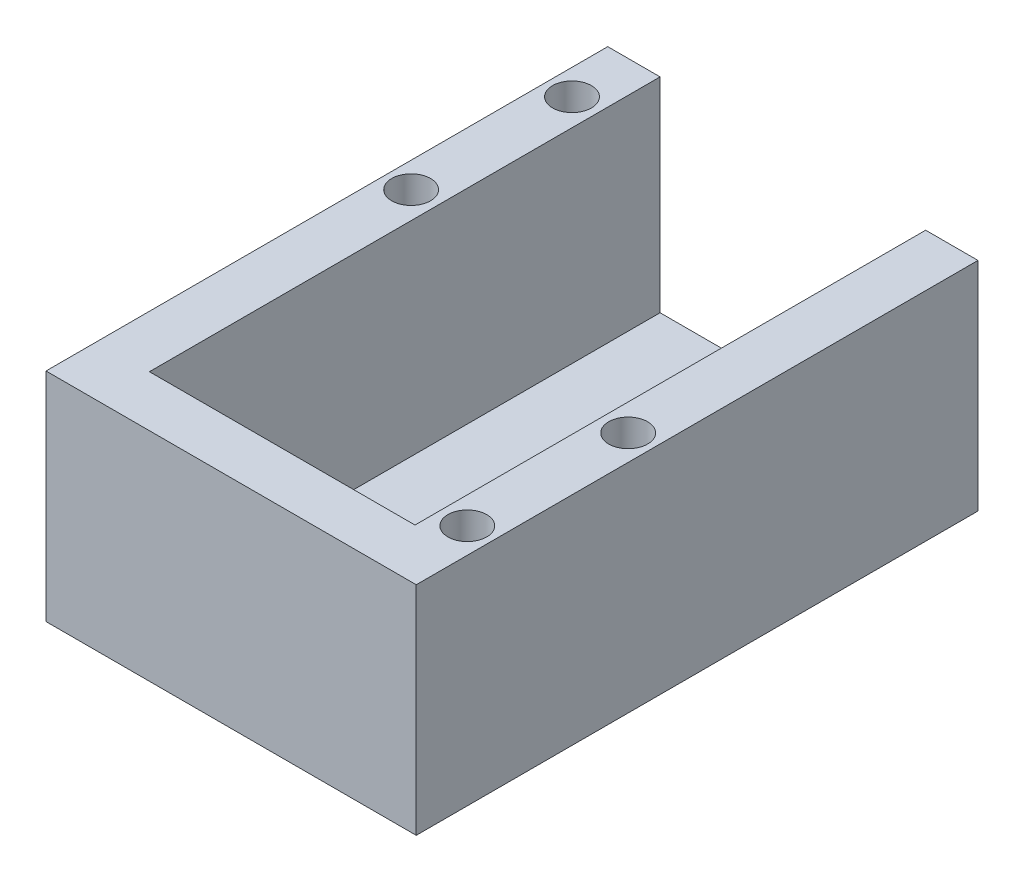
ISO-10303-21;
HEADER;
FILE_DESCRIPTION(('STEP AP214'),'2;1');
FILE_NAME('part.step','',(''),(''),'','','');
FILE_SCHEMA(('AUTOMOTIVE_DESIGN { 1 0 10303 214 1 1 1 1 }'));
ENDSEC;
DATA;
#1=APPLICATION_CONTEXT('core data for automotive mechanical design processes');
#2=APPLICATION_PROTOCOL_DEFINITION('international standard','automotive_design',2000,#1);
#3=PRODUCT_CONTEXT('',#1,'mechanical');
#4=PRODUCT('Part','Part','',(#3));
#5=PRODUCT_RELATED_PRODUCT_CATEGORY('part','',(#4));
#6=PRODUCT_DEFINITION_FORMATION('','',#4);
#7=PRODUCT_DEFINITION_CONTEXT('part definition',#1,'design');
#8=PRODUCT_DEFINITION('design','',#6,#7);
#9=PRODUCT_DEFINITION_SHAPE('','',#8);
#10=(LENGTH_UNIT() NAMED_UNIT(*) SI_UNIT(.MILLI.,.METRE.));
#11=(NAMED_UNIT(*) PLANE_ANGLE_UNIT() SI_UNIT($,.RADIAN.));
#12=(NAMED_UNIT(*) SI_UNIT($,.STERADIAN.) SOLID_ANGLE_UNIT());
#13=UNCERTAINTY_MEASURE_WITH_UNIT(LENGTH_MEASURE(1.E-05),#10,'distance_accuracy_value','');
#14=(GEOMETRIC_REPRESENTATION_CONTEXT(3) GLOBAL_UNCERTAINTY_ASSIGNED_CONTEXT((#13)) GLOBAL_UNIT_ASSIGNED_CONTEXT((#10,
#11,#12)) REPRESENTATION_CONTEXT('',''));
#15=CARTESIAN_POINT('',(0.,0.,0.));
#16=DIRECTION('',(0.,0.,1.));
#17=DIRECTION('',(1.,0.,0.));
#18=AXIS2_PLACEMENT_3D('',#15,#16,#17);
#19=CARTESIAN_POINT('',(-18.415,21.59,0.));
#20=DIRECTION('',(0.,0.,-1.));
#21=DIRECTION('',(-1.,0.,0.));
#22=AXIS2_PLACEMENT_3D('',#19,#20,#21);
#23=PLANE('',#22);
#24=DIRECTION('',(1.,0.,0.));
#25=VECTOR('',#24,1.);
#26=CARTESIAN_POINT('',(-18.415,0.,0.));
#27=LINE('',#26,#25);
#28=CARTESIAN_POINT('',(-18.415,0.,0.));
#29=VERTEX_POINT('',#28);
#30=CARTESIAN_POINT('',(18.415,0.,0.));
#31=VERTEX_POINT('',#30);
#32=EDGE_CURVE('E193',#29,#31,#27,.T.);
#33=ORIENTED_EDGE('',*,*,#32,.T.);
#34=DIRECTION('',(0.,-1.,0.));
#35=VECTOR('',#34,1.);
#36=CARTESIAN_POINT('',(18.415,21.59,0.));
#37=LINE('',#36,#35);
#38=CARTESIAN_POINT('',(18.415,21.59,0.));
#39=VERTEX_POINT('',#38);
#40=EDGE_CURVE('E11',#39,#31,#37,.T.);
#41=ORIENTED_EDGE('',*,*,#40,.F.);
#42=DIRECTION('',(1.,0.,0.));
#43=VECTOR('',#42,1.);
#44=CARTESIAN_POINT('',(-18.415,21.59,0.));
#45=LINE('',#44,#43);
#46=CARTESIAN_POINT('',(-18.415,21.59,0.));
#47=VERTEX_POINT('',#46);
#48=EDGE_CURVE('E203',#47,#39,#45,.T.);
#49=ORIENTED_EDGE('',*,*,#48,.F.);
#50=DIRECTION('',(0.,-1.,0.));
#51=VECTOR('',#50,1.);
#52=CARTESIAN_POINT('',(-18.415,21.59,0.));
#53=LINE('',#52,#51);
#54=EDGE_CURVE('E215',#47,#29,#53,.T.);
#55=ORIENTED_EDGE('',*,*,#54,.T.);
#56=EDGE_LOOP('',(#33,#41,#49,#55));
#57=FACE_BOUND('',#56,.T.);
#58=ADVANCED_FACE('F39',(#57),#23,.F.);
#59=CARTESIAN_POINT('',(18.415,21.59,0.));
#60=DIRECTION('',(-1.,0.,0.));
#61=DIRECTION('',(0.,0.,1.));
#62=AXIS2_PLACEMENT_3D('',#59,#60,#61);
#63=PLANE('',#62);
#64=DIRECTION('',(0.,0.,-1.));
#65=VECTOR('',#64,1.);
#66=CARTESIAN_POINT('',(18.415,0.,0.));
#67=LINE('',#66,#65);
#68=CARTESIAN_POINT('',(18.415,0.,-55.88));
#69=VERTEX_POINT('',#68);
#70=EDGE_CURVE('E219',#31,#69,#67,.T.);
#71=ORIENTED_EDGE('',*,*,#70,.T.);
#72=DIRECTION('',(0.,-1.,0.));
#73=VECTOR('',#72,1.);
#74=CARTESIAN_POINT('',(18.415,21.59,-55.88));
#75=LINE('',#74,#73);
#76=CARTESIAN_POINT('',(18.415,21.59,-55.88));
#77=VERTEX_POINT('',#76);
#78=EDGE_CURVE('E47',#77,#69,#75,.T.);
#79=ORIENTED_EDGE('',*,*,#78,.F.);
#80=DIRECTION('',(0.,0.,-1.));
#81=VECTOR('',#80,1.);
#82=CARTESIAN_POINT('',(18.415,21.59,0.));
#83=LINE('',#82,#81);
#84=EDGE_CURVE('E91',#39,#77,#83,.T.);
#85=ORIENTED_EDGE('',*,*,#84,.F.);
#86=ORIENTED_EDGE('',*,*,#40,.T.);
#87=EDGE_LOOP('',(#71,#79,#85,#86));
#88=FACE_BOUND('',#87,.T.);
#89=ADVANCED_FACE('F274',(#88),#63,.F.);
#90=CARTESIAN_POINT('',(-18.415,21.59,-55.88));
#91=DIRECTION('',(0.,0.,1.));
#92=DIRECTION('',(1.,0.,0.));
#93=AXIS2_PLACEMENT_3D('',#90,#91,#92);
#94=PLANE('',#93);
#95=DIRECTION('',(-1.,0.,0.));
#96=VECTOR('',#95,1.);
#97=CARTESIAN_POINT('',(-18.415,21.59,-55.88));
#98=LINE('',#97,#96);
#99=CARTESIAN_POINT('',(-13.208,21.59,-55.88));
#100=VERTEX_POINT('',#99);
#101=CARTESIAN_POINT('',(-18.415,21.59,-55.88));
#102=VERTEX_POINT('',#101);
#103=EDGE_CURVE('E208',#100,#102,#98,.T.);
#104=ORIENTED_EDGE('',*,*,#103,.F.);
#105=DIRECTION('',(0.,1.,0.));
#106=VECTOR('',#105,1.);
#107=CARTESIAN_POINT('',(-13.208,21.59,-55.88));
#108=LINE('',#107,#106);
#109=CARTESIAN_POINT('',(-13.208,1.27,-55.88));
#110=VERTEX_POINT('',#109);
#111=EDGE_CURVE('E166',#110,#100,#108,.T.);
#112=ORIENTED_EDGE('',*,*,#111,.F.);
#113=DIRECTION('',(-1.,0.,0.));
#114=VECTOR('',#113,1.);
#115=CARTESIAN_POINT('',(13.208,1.27,-55.88));
#116=LINE('',#115,#114);
#117=CARTESIAN_POINT('',(13.208,1.27,-55.88));
#118=VERTEX_POINT('',#117);
#119=EDGE_CURVE('E170',#118,#110,#116,.T.);
#120=ORIENTED_EDGE('',*,*,#119,.F.);
#121=DIRECTION('',(0.,-1.,0.));
#122=VECTOR('',#121,1.);
#123=CARTESIAN_POINT('',(13.208,21.59,-55.88));
#124=LINE('',#123,#122);
#125=CARTESIAN_POINT('',(13.208,21.59,-55.88));
#126=VERTEX_POINT('',#125);
#127=EDGE_CURVE('E183',#126,#118,#124,.T.);
#128=ORIENTED_EDGE('',*,*,#127,.F.);
#129=EDGE_CURVE('E209',#77,#126,#98,.T.);
#130=ORIENTED_EDGE('',*,*,#129,.F.);
#131=ORIENTED_EDGE('',*,*,#78,.T.);
#132=DIRECTION('',(-1.,0.,0.));
#133=VECTOR('',#132,1.);
#134=CARTESIAN_POINT('',(-18.415,0.,-55.88));
#135=LINE('',#134,#133);
#136=CARTESIAN_POINT('',(-18.415,0.,-55.88));
#137=VERTEX_POINT('',#136);
#138=EDGE_CURVE('E222',#69,#137,#135,.T.);
#139=ORIENTED_EDGE('',*,*,#138,.T.);
#140=DIRECTION('',(0.,-1.,0.));
#141=VECTOR('',#140,1.);
#142=CARTESIAN_POINT('',(-18.415,21.59,-55.88));
#143=LINE('',#142,#141);
#144=EDGE_CURVE('E229',#102,#137,#143,.T.);
#145=ORIENTED_EDGE('',*,*,#144,.F.);
#146=EDGE_LOOP('',(#104,#112,#120,#128,#130,#131,#139,#145));
#147=FACE_BOUND('',#146,.T.);
#148=ADVANCED_FACE('F237',(#147),#94,.F.);
#149=CARTESIAN_POINT('',(-18.415,21.59,0.));
#150=DIRECTION('',(1.,0.,0.));
#151=DIRECTION('',(0.,0.,-1.));
#152=AXIS2_PLACEMENT_3D('',#149,#150,#151);
#153=PLANE('',#152);
#154=DIRECTION('',(0.,0.,1.));
#155=VECTOR('',#154,1.);
#156=CARTESIAN_POINT('',(-18.415,0.,0.));
#157=LINE('',#156,#155);
#158=EDGE_CURVE('E84',#137,#29,#157,.T.);
#159=ORIENTED_EDGE('',*,*,#158,.T.);
#160=ORIENTED_EDGE('',*,*,#54,.F.);
#161=DIRECTION('',(0.,0.,1.));
#162=VECTOR('',#161,1.);
#163=CARTESIAN_POINT('',(-18.415,21.59,0.));
#164=LINE('',#163,#162);
#165=EDGE_CURVE('E63',#102,#47,#164,.T.);
#166=ORIENTED_EDGE('',*,*,#165,.F.);
#167=ORIENTED_EDGE('',*,*,#144,.T.);
#168=EDGE_LOOP('',(#159,#160,#166,#167));
#169=FACE_BOUND('',#168,.T.);
#170=ADVANCED_FACE('F246',(#169),#153,.F.);
#171=CARTESIAN_POINT('',(0.,21.59,0.));
#172=DIRECTION('',(0.,1.,0.));
#173=DIRECTION('',(0.,0.,1.));
#174=AXIS2_PLACEMENT_3D('',#171,#172,#173);
#175=PLANE('',#174);
#176=CARTESIAN_POINT('',(15.875,21.59,-7.62000000000001));
#177=DIRECTION('',(0.,1.,0.));
#178=DIRECTION('',(0.,0.,1.));
#179=AXIS2_PLACEMENT_3D('',#176,#177,#178);
#180=CIRCLE('',#179,1.9304);
#181=CARTESIAN_POINT('',(15.875,21.59,-5.68960000000001));
#182=VERTEX_POINT('',#181);
#183=EDGE_CURVE('E137',#182,#182,#180,.T.);
#184=ORIENTED_EDGE('',*,*,#183,.F.);
#185=EDGE_LOOP('',(#184));
#186=FACE_BOUND('',#185,.T.);
#187=CARTESIAN_POINT('',(15.875,21.59,-23.622));
#188=DIRECTION('',(0.,1.,0.));
#189=DIRECTION('',(0.,0.,1.));
#190=AXIS2_PLACEMENT_3D('',#187,#188,#189);
#191=CIRCLE('',#190,1.9304);
#192=CARTESIAN_POINT('',(15.875,21.59,-21.6916));
#193=VERTEX_POINT('',#192);
#194=EDGE_CURVE('E136',#193,#193,#191,.T.);
#195=ORIENTED_EDGE('',*,*,#194,.F.);
#196=EDGE_LOOP('',(#195));
#197=FACE_BOUND('',#196,.T.);
#198=CARTESIAN_POINT('',(-15.875,21.59,-33.782));
#199=DIRECTION('',(0.,1.,0.));
#200=DIRECTION('',(0.,0.,1.));
#201=AXIS2_PLACEMENT_3D('',#198,#199,#200);
#202=CIRCLE('',#201,1.9304);
#203=CARTESIAN_POINT('',(-15.875,21.59,-31.8516));
#204=VERTEX_POINT('',#203);
#205=EDGE_CURVE('E150',#204,#204,#202,.T.);
#206=ORIENTED_EDGE('',*,*,#205,.F.);
#207=EDGE_LOOP('',(#206));
#208=FACE_BOUND('',#207,.T.);
#209=CARTESIAN_POINT('',(-15.875,21.59,-49.784));
#210=DIRECTION('',(0.,1.,0.));
#211=DIRECTION('',(0.,0.,1.));
#212=AXIS2_PLACEMENT_3D('',#209,#210,#211);
#213=CIRCLE('',#212,1.9304);
#214=CARTESIAN_POINT('',(-15.875,21.59,-47.8536));
#215=VERTEX_POINT('',#214);
#216=EDGE_CURVE('E158',#215,#215,#213,.T.);
#217=ORIENTED_EDGE('',*,*,#216,.F.);
#218=EDGE_LOOP('',(#217));
#219=FACE_BOUND('',#218,.T.);
#220=DIRECTION('',(0.,0.,-1.));
#221=VECTOR('',#220,1.);
#222=CARTESIAN_POINT('',(-13.208,21.59,-5.08000000000002));
#223=LINE('',#222,#221);
#224=CARTESIAN_POINT('',(-13.208,21.59,-5.08000000000002));
#225=VERTEX_POINT('',#224);
#226=EDGE_CURVE('E180',#225,#100,#223,.T.);
#227=ORIENTED_EDGE('',*,*,#226,.T.);
#228=ORIENTED_EDGE('',*,*,#103,.T.);
#229=ORIENTED_EDGE('',*,*,#165,.T.);
#230=ORIENTED_EDGE('',*,*,#48,.T.);
#231=ORIENTED_EDGE('',*,*,#84,.T.);
#232=ORIENTED_EDGE('',*,*,#129,.T.);
#233=DIRECTION('',(0.,0.,-1.));
#234=VECTOR('',#233,1.);
#235=CARTESIAN_POINT('',(13.208,21.59,-5.08000000000002));
#236=LINE('',#235,#234);
#237=CARTESIAN_POINT('',(13.208,21.59,-5.08000000000002));
#238=VERTEX_POINT('',#237);
#239=EDGE_CURVE('E197',#238,#126,#236,.T.);
#240=ORIENTED_EDGE('',*,*,#239,.F.);
#241=DIRECTION('',(1.,0.,0.));
#242=VECTOR('',#241,1.);
#243=CARTESIAN_POINT('',(13.208,21.59,-5.08000000000002));
#244=LINE('',#243,#242);
#245=EDGE_CURVE('E169',#225,#238,#244,.T.);
#246=ORIENTED_EDGE('',*,*,#245,.F.);
#247=EDGE_LOOP('',(#227,#228,#229,#230,#231,#232,#240,#246));
#248=FACE_BOUND('',#247,.T.);
#249=ADVANCED_FACE('F250',(#186,#197,#208,#219,#248),#175,.T.);
#250=CARTESIAN_POINT('',(0.,0.,0.));
#251=DIRECTION('',(0.,1.,0.));
#252=DIRECTION('',(0.,0.,1.));
#253=AXIS2_PLACEMENT_3D('',#250,#251,#252);
#254=PLANE('',#253);
#255=ORIENTED_EDGE('',*,*,#32,.F.);
#256=ORIENTED_EDGE('',*,*,#158,.F.);
#257=ORIENTED_EDGE('',*,*,#138,.F.);
#258=ORIENTED_EDGE('',*,*,#70,.F.);
#259=EDGE_LOOP('',(#255,#256,#257,#258));
#260=FACE_BOUND('',#259,.T.);
#261=ADVANCED_FACE('F242',(#260),#254,.F.);
#262=CARTESIAN_POINT('',(-13.208,21.59,-5.08000000000002));
#263=DIRECTION('',(-1.,0.,0.));
#264=DIRECTION('',(0.,0.,1.));
#265=AXIS2_PLACEMENT_3D('',#262,#263,#264);
#266=PLANE('',#265);
#267=ORIENTED_EDGE('',*,*,#111,.T.);
#268=ORIENTED_EDGE('',*,*,#226,.F.);
#269=DIRECTION('',(0.,1.,0.));
#270=VECTOR('',#269,1.);
#271=CARTESIAN_POINT('',(-13.208,21.59,-5.08000000000002));
#272=LINE('',#271,#270);
#273=CARTESIAN_POINT('',(-13.208,1.27,-5.08000000000002));
#274=VERTEX_POINT('',#273);
#275=EDGE_CURVE('E54',#274,#225,#272,.T.);
#276=ORIENTED_EDGE('',*,*,#275,.F.);
#277=DIRECTION('',(0.,0.,-1.));
#278=VECTOR('',#277,1.);
#279=CARTESIAN_POINT('',(-13.208,1.27,-5.08000000000002));
#280=LINE('',#279,#278);
#281=EDGE_CURVE('E190',#274,#110,#280,.T.);
#282=ORIENTED_EDGE('',*,*,#281,.T.);
#283=EDGE_LOOP('',(#267,#268,#276,#282));
#284=FACE_BOUND('',#283,.T.);
#285=ADVANCED_FACE('F254',(#284),#266,.F.);
#286=CARTESIAN_POINT('',(13.208,1.27,-5.08000000000002));
#287=DIRECTION('',(0.,-1.,0.));
#288=DIRECTION('',(0.,0.,-1.));
#289=AXIS2_PLACEMENT_3D('',#286,#287,#288);
#290=PLANE('',#289);
#291=ORIENTED_EDGE('',*,*,#119,.T.);
#292=ORIENTED_EDGE('',*,*,#281,.F.);
#293=DIRECTION('',(-1.,0.,0.));
#294=VECTOR('',#293,1.);
#295=CARTESIAN_POINT('',(13.208,1.27,-5.08000000000002));
#296=LINE('',#295,#294);
#297=CARTESIAN_POINT('',(13.208,1.27,-5.08000000000002));
#298=VERTEX_POINT('',#297);
#299=EDGE_CURVE('E177',#298,#274,#296,.T.);
#300=ORIENTED_EDGE('',*,*,#299,.F.);
#301=DIRECTION('',(0.,0.,-1.));
#302=VECTOR('',#301,1.);
#303=CARTESIAN_POINT('',(13.208,1.27,-5.08000000000002));
#304=LINE('',#303,#302);
#305=EDGE_CURVE('E194',#298,#118,#304,.T.);
#306=ORIENTED_EDGE('',*,*,#305,.T.);
#307=EDGE_LOOP('',(#291,#292,#300,#306));
#308=FACE_BOUND('',#307,.T.);
#309=ADVANCED_FACE('F257',(#308),#290,.F.);
#310=CARTESIAN_POINT('',(13.208,21.59,-5.08000000000002));
#311=DIRECTION('',(1.,0.,0.));
#312=DIRECTION('',(0.,1.,0.));
#313=AXIS2_PLACEMENT_3D('',#310,#311,#312);
#314=PLANE('',#313);
#315=ORIENTED_EDGE('',*,*,#127,.T.);
#316=ORIENTED_EDGE('',*,*,#305,.F.);
#317=DIRECTION('',(0.,-1.,0.));
#318=VECTOR('',#317,1.);
#319=CARTESIAN_POINT('',(13.208,21.59,-5.08000000000002));
#320=LINE('',#319,#318);
#321=EDGE_CURVE('E173',#238,#298,#320,.T.);
#322=ORIENTED_EDGE('',*,*,#321,.F.);
#323=ORIENTED_EDGE('',*,*,#239,.T.);
#324=EDGE_LOOP('',(#315,#316,#322,#323));
#325=FACE_BOUND('',#324,.T.);
#326=ADVANCED_FACE('F259',(#325),#314,.F.);
#327=CARTESIAN_POINT('',(0.,0.,-5.08000000000002));
#328=DIRECTION('',(0.,0.,-1.));
#329=DIRECTION('',(-1.,0.,0.));
#330=AXIS2_PLACEMENT_3D('',#327,#328,#329);
#331=PLANE('',#330);
#332=ORIENTED_EDGE('',*,*,#275,.T.);
#333=ORIENTED_EDGE('',*,*,#245,.T.);
#334=ORIENTED_EDGE('',*,*,#321,.T.);
#335=ORIENTED_EDGE('',*,*,#299,.T.);
#336=EDGE_LOOP('',(#332,#333,#334,#335));
#337=FACE_BOUND('',#336,.T.);
#338=ADVANCED_FACE('F260',(#337),#331,.T.);
#339=CARTESIAN_POINT('',(-15.875,16.51,-49.784));
#340=DIRECTION('',(0.,1.,0.));
#341=DIRECTION('',(0.,0.,1.));
#342=AXIS2_PLACEMENT_3D('',#339,#340,#341);
#343=CONICAL_SURFACE('',#342,1.9304,1.02974425867665);
#344=CARTESIAN_POINT('',(-15.875,15.3500986610292,-49.784));
#345=VERTEX_POINT('',#344);
#346=VERTEX_LOOP('',#345);
#347=FACE_BOUND('',#346,.T.);
#348=CARTESIAN_POINT('',(-15.875,16.51,-49.784));
#349=DIRECTION('',(0.,1.,0.));
#350=DIRECTION('',(0.,0.,1.));
#351=AXIS2_PLACEMENT_3D('',#348,#349,#350);
#352=CIRCLE('',#351,1.9304);
#353=CARTESIAN_POINT('',(-15.875,16.51,-47.8536));
#354=VERTEX_POINT('',#353);
#355=EDGE_CURVE('E162',#354,#354,#352,.T.);
#356=ORIENTED_EDGE('',*,*,#355,.T.);
#357=EDGE_LOOP('',(#356));
#358=FACE_BOUND('',#357,.T.);
#359=ADVANCED_FACE('F262',(#347,#358),#343,.F.);
#360=CARTESIAN_POINT('',(-15.875,21.59,-49.784));
#361=DIRECTION('',(0.,1.,0.));
#362=DIRECTION('',(0.,0.,1.));
#363=AXIS2_PLACEMENT_3D('',#360,#361,#362);
#364=CYLINDRICAL_SURFACE('',#363,1.9304);
#365=ORIENTED_EDGE('',*,*,#355,.F.);
#366=EDGE_LOOP('',(#365));
#367=FACE_BOUND('',#366,.T.);
#368=ORIENTED_EDGE('',*,*,#216,.T.);
#369=EDGE_LOOP('',(#368));
#370=FACE_BOUND('',#369,.T.);
#371=ADVANCED_FACE('F268',(#367,#370),#364,.F.);
#372=CARTESIAN_POINT('',(-15.875,16.51,-33.782));
#373=DIRECTION('',(0.,1.,0.));
#374=DIRECTION('',(0.,0.,1.));
#375=AXIS2_PLACEMENT_3D('',#372,#373,#374);
#376=CONICAL_SURFACE('',#375,1.9304,1.02974425867665);
#377=CARTESIAN_POINT('',(-15.875,15.3500986610292,-33.782));
#378=VERTEX_POINT('',#377);
#379=VERTEX_LOOP('',#378);
#380=FACE_BOUND('',#379,.T.);
#381=CARTESIAN_POINT('',(-15.875,16.51,-33.782));
#382=DIRECTION('',(0.,1.,0.));
#383=DIRECTION('',(0.,0.,1.));
#384=AXIS2_PLACEMENT_3D('',#381,#382,#383);
#385=CIRCLE('',#384,1.9304);
#386=CARTESIAN_POINT('',(-15.875,16.51,-31.8516));
#387=VERTEX_POINT('',#386);
#388=EDGE_CURVE('E154',#387,#387,#385,.T.);
#389=ORIENTED_EDGE('',*,*,#388,.T.);
#390=EDGE_LOOP('',(#389));
#391=FACE_BOUND('',#390,.T.);
#392=ADVANCED_FACE('F327',(#380,#391),#376,.F.);
#393=CARTESIAN_POINT('',(-15.875,21.59,-33.782));
#394=DIRECTION('',(0.,1.,0.));
#395=DIRECTION('',(0.,0.,1.));
#396=AXIS2_PLACEMENT_3D('',#393,#394,#395);
#397=CYLINDRICAL_SURFACE('',#396,1.9304);
#398=ORIENTED_EDGE('',*,*,#388,.F.);
#399=EDGE_LOOP('',(#398));
#400=FACE_BOUND('',#399,.T.);
#401=ORIENTED_EDGE('',*,*,#205,.T.);
#402=EDGE_LOOP('',(#401));
#403=FACE_BOUND('',#402,.T.);
#404=ADVANCED_FACE('F337',(#400,#403),#397,.F.);
#405=CARTESIAN_POINT('',(15.875,16.51,-23.622));
#406=DIRECTION('',(0.,1.,0.));
#407=DIRECTION('',(0.,0.,1.));
#408=AXIS2_PLACEMENT_3D('',#405,#406,#407);
#409=CONICAL_SURFACE('',#408,1.9304,1.02974425867665);
#410=CARTESIAN_POINT('',(15.875,15.3500986610292,-23.622));
#411=VERTEX_POINT('',#410);
#412=VERTEX_LOOP('',#411);
#413=FACE_BOUND('',#412,.T.);
#414=CARTESIAN_POINT('',(15.875,16.51,-23.622));
#415=DIRECTION('',(0.,1.,0.));
#416=DIRECTION('',(0.,0.,1.));
#417=AXIS2_PLACEMENT_3D('',#414,#415,#416);
#418=CIRCLE('',#417,1.9304);
#419=CARTESIAN_POINT('',(15.875,16.51,-21.6916));
#420=VERTEX_POINT('',#419);
#421=EDGE_CURVE('E142',#420,#420,#418,.T.);
#422=ORIENTED_EDGE('',*,*,#421,.T.);
#423=EDGE_LOOP('',(#422));
#424=FACE_BOUND('',#423,.T.);
#425=ADVANCED_FACE('F347',(#413,#424),#409,.F.);
#426=CARTESIAN_POINT('',(15.875,21.59,-23.622));
#427=DIRECTION('',(0.,1.,0.));
#428=DIRECTION('',(0.,0.,1.));
#429=AXIS2_PLACEMENT_3D('',#426,#427,#428);
#430=CYLINDRICAL_SURFACE('',#429,1.9304);
#431=ORIENTED_EDGE('',*,*,#421,.F.);
#432=EDGE_LOOP('',(#431));
#433=FACE_BOUND('',#432,.T.);
#434=ORIENTED_EDGE('',*,*,#194,.T.);
#435=EDGE_LOOP('',(#434));
#436=FACE_BOUND('',#435,.T.);
#437=ADVANCED_FACE('F129',(#433,#436),#430,.F.);
#438=CARTESIAN_POINT('',(15.875,16.51,-7.62000000000001));
#439=DIRECTION('',(0.,1.,0.));
#440=DIRECTION('',(0.,0.,1.));
#441=AXIS2_PLACEMENT_3D('',#438,#439,#440);
#442=CONICAL_SURFACE('',#441,1.9304,1.02974425867665);
#443=CARTESIAN_POINT('',(15.875,15.3500986610292,-7.62000000000001));
#444=VERTEX_POINT('',#443);
#445=VERTEX_LOOP('',#444);
#446=FACE_BOUND('',#445,.T.);
#447=CARTESIAN_POINT('',(15.875,16.51,-7.62000000000001));
#448=DIRECTION('',(0.,1.,0.));
#449=DIRECTION('',(0.,0.,1.));
#450=AXIS2_PLACEMENT_3D('',#447,#448,#449);
#451=CIRCLE('',#450,1.9304);
#452=CARTESIAN_POINT('',(15.875,16.51,-5.68960000000001));
#453=VERTEX_POINT('',#452);
#454=EDGE_CURVE('E133',#453,#453,#451,.T.);
#455=ORIENTED_EDGE('',*,*,#454,.T.);
#456=EDGE_LOOP('',(#455));
#457=FACE_BOUND('',#456,.T.);
#458=ADVANCED_FACE('F125',(#446,#457),#442,.F.);
#459=CARTESIAN_POINT('',(15.875,21.59,-7.62000000000001));
#460=DIRECTION('',(0.,1.,0.));
#461=DIRECTION('',(0.,0.,1.));
#462=AXIS2_PLACEMENT_3D('',#459,#460,#461);
#463=CYLINDRICAL_SURFACE('',#462,1.9304);
#464=ORIENTED_EDGE('',*,*,#454,.F.);
#465=EDGE_LOOP('',(#464));
#466=FACE_BOUND('',#465,.T.);
#467=ORIENTED_EDGE('',*,*,#183,.T.);
#468=EDGE_LOOP('',(#467));
#469=FACE_BOUND('',#468,.T.);
#470=ADVANCED_FACE('F128',(#466,#469),#463,.F.);
#471=CLOSED_SHELL('',(#58,#89,#148,#170,#249,#261,#285,#309,#326,#338,#359,#371,#392,#404,#425,
#437,#458,#470));
#472=MANIFOLD_SOLID_BREP('B2',#471);
#473=ADVANCED_BREP_SHAPE_REPRESENTATION('',(#18,#472),#14);
#474=SHAPE_DEFINITION_REPRESENTATION(#9,#473);
ENDSEC;
END-ISO-10303-21;
